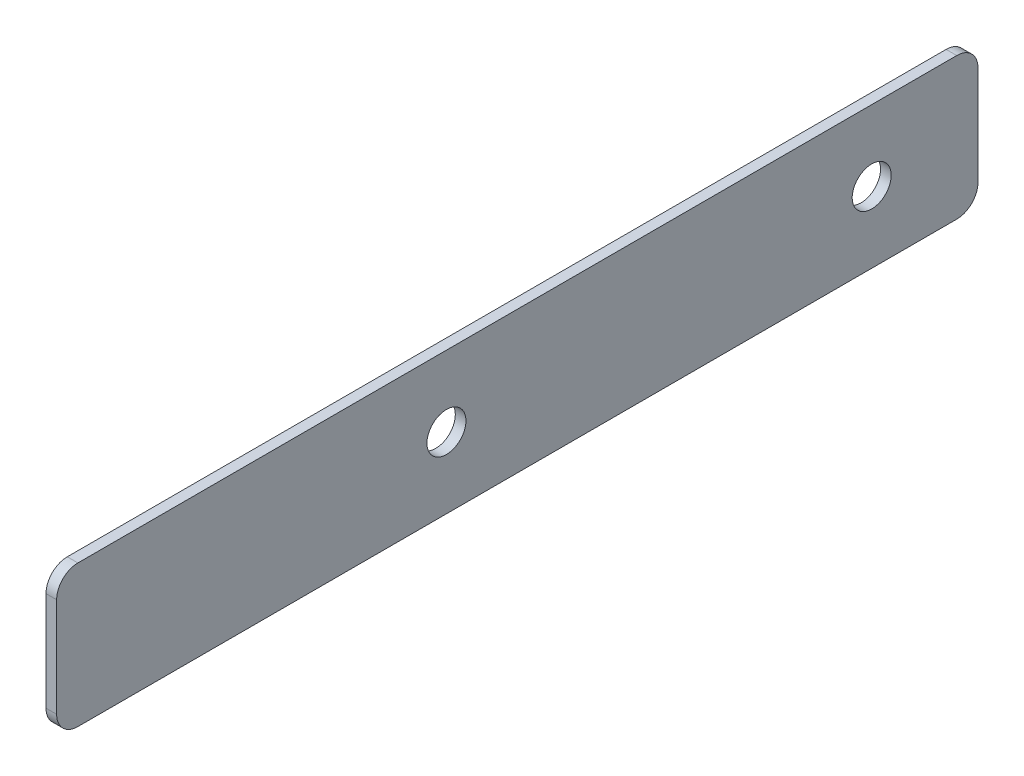
ISO-10303-21;
HEADER;
FILE_DESCRIPTION(('STEP AP214'),'2;1');
FILE_NAME('part.step','',(''),(''),'','','');
FILE_SCHEMA(('AUTOMOTIVE_DESIGN { 1 0 10303 214 1 1 1 1 }'));
ENDSEC;
DATA;
#1=APPLICATION_CONTEXT('core data for automotive mechanical design processes');
#2=APPLICATION_PROTOCOL_DEFINITION('international standard','automotive_design',2000,#1);
#3=PRODUCT_CONTEXT('',#1,'mechanical');
#4=PRODUCT('Part','Part','',(#3));
#5=PRODUCT_RELATED_PRODUCT_CATEGORY('part','',(#4));
#6=PRODUCT_DEFINITION_FORMATION('','',#4);
#7=PRODUCT_DEFINITION_CONTEXT('part definition',#1,'design');
#8=PRODUCT_DEFINITION('design','',#6,#7);
#9=PRODUCT_DEFINITION_SHAPE('','',#8);
#10=(LENGTH_UNIT() NAMED_UNIT(*) SI_UNIT(.MILLI.,.METRE.));
#11=(NAMED_UNIT(*) PLANE_ANGLE_UNIT() SI_UNIT($,.RADIAN.));
#12=(NAMED_UNIT(*) SI_UNIT($,.STERADIAN.) SOLID_ANGLE_UNIT());
#13=UNCERTAINTY_MEASURE_WITH_UNIT(LENGTH_MEASURE(1.E-05),#10,'distance_accuracy_value','');
#14=(GEOMETRIC_REPRESENTATION_CONTEXT(3) GLOBAL_UNCERTAINTY_ASSIGNED_CONTEXT((#13)) GLOBAL_UNIT_ASSIGNED_CONTEXT((#10,
#11,#12)) REPRESENTATION_CONTEXT('',''));
#15=CARTESIAN_POINT('',(0.,0.,0.));
#16=DIRECTION('',(0.,0.,1.));
#17=DIRECTION('',(1.,0.,0.));
#18=AXIS2_PLACEMENT_3D('',#15,#16,#17);
#19=CARTESIAN_POINT('',(-1.5,10.,-65.));
#20=DIRECTION('',(0.,0.,-1.));
#21=DIRECTION('',(-1.,0.,0.));
#22=AXIS2_PLACEMENT_3D('',#19,#20,#21);
#23=PLANE('',#22);
#24=DIRECTION('',(0.,1.,0.));
#25=VECTOR('',#24,1.);
#26=CARTESIAN_POINT('',(0.,10.,-65.));
#27=LINE('',#26,#25);
#28=CARTESIAN_POINT('',(0.,-7.,-65.));
#29=VERTEX_POINT('',#28);
#30=CARTESIAN_POINT('',(0.,7.,-65.));
#31=VERTEX_POINT('',#30);
#32=EDGE_CURVE('E181',#29,#31,#27,.T.);
#33=ORIENTED_EDGE('',*,*,#32,.F.);
#34=DIRECTION('',(1.,0.,0.));
#35=VECTOR('',#34,1.);
#36=CARTESIAN_POINT('',(-1.5,-7.,-65.));
#37=LINE('',#36,#35);
#38=CARTESIAN_POINT('',(-1.5,-7.,-65.));
#39=VERTEX_POINT('',#38);
#40=EDGE_CURVE('E156',#29,#39,#37,.F.);
#41=ORIENTED_EDGE('',*,*,#40,.T.);
#42=DIRECTION('',(0.,1.,0.));
#43=VECTOR('',#42,1.);
#44=CARTESIAN_POINT('',(-1.5,10.,-65.));
#45=LINE('',#44,#43);
#46=CARTESIAN_POINT('',(-1.5,7.,-65.));
#47=VERTEX_POINT('',#46);
#48=EDGE_CURVE('E137',#39,#47,#45,.T.);
#49=ORIENTED_EDGE('',*,*,#48,.T.);
#50=DIRECTION('',(1.,0.,0.));
#51=VECTOR('',#50,1.);
#52=CARTESIAN_POINT('',(-1.5,7.,-65.));
#53=LINE('',#52,#51);
#54=EDGE_CURVE('E153',#47,#31,#53,.T.);
#55=ORIENTED_EDGE('',*,*,#54,.T.);
#56=EDGE_LOOP('',(#33,#41,#49,#55));
#57=FACE_BOUND('',#56,.T.);
#58=ADVANCED_FACE('F50',(#57),#23,.T.);
#59=CARTESIAN_POINT('',(-1.5,-10.,65.));
#60=DIRECTION('',(0.,-1.,0.));
#61=DIRECTION('',(0.,0.,-1.));
#62=AXIS2_PLACEMENT_3D('',#59,#60,#61);
#63=PLANE('',#62);
#64=DIRECTION('',(0.,0.,-1.));
#65=VECTOR('',#64,1.);
#66=CARTESIAN_POINT('',(-1.5,-10.,65.));
#67=LINE('',#66,#65);
#68=CARTESIAN_POINT('',(-1.5,-10.,62.));
#69=VERTEX_POINT('',#68);
#70=CARTESIAN_POINT('',(-1.5,-10.,-62.));
#71=VERTEX_POINT('',#70);
#72=EDGE_CURVE('E142',#69,#71,#67,.T.);
#73=ORIENTED_EDGE('',*,*,#72,.T.);
#74=DIRECTION('',(1.,0.,0.));
#75=VECTOR('',#74,1.);
#76=CARTESIAN_POINT('',(-1.5,-10.,-62.));
#77=LINE('',#76,#75);
#78=CARTESIAN_POINT('',(0.,-10.,-62.));
#79=VERTEX_POINT('',#78);
#80=EDGE_CURVE('E136',#71,#79,#77,.T.);
#81=ORIENTED_EDGE('',*,*,#80,.T.);
#82=DIRECTION('',(0.,0.,-1.));
#83=VECTOR('',#82,1.);
#84=CARTESIAN_POINT('',(0.,-10.,65.));
#85=LINE('',#84,#83);
#86=CARTESIAN_POINT('',(0.,-10.,62.));
#87=VERTEX_POINT('',#86);
#88=EDGE_CURVE('E120',#87,#79,#85,.T.);
#89=ORIENTED_EDGE('',*,*,#88,.F.);
#90=DIRECTION('',(1.,0.,0.));
#91=VECTOR('',#90,1.);
#92=CARTESIAN_POINT('',(-1.5,-10.,62.));
#93=LINE('',#92,#91);
#94=EDGE_CURVE('E133',#87,#69,#93,.F.);
#95=ORIENTED_EDGE('',*,*,#94,.T.);
#96=EDGE_LOOP('',(#73,#81,#89,#95));
#97=FACE_BOUND('',#96,.T.);
#98=ADVANCED_FACE('F132',(#97),#63,.T.);
#99=CARTESIAN_POINT('',(-1.5,10.,65.));
#100=DIRECTION('',(0.,0.,1.));
#101=DIRECTION('',(1.,0.,0.));
#102=AXIS2_PLACEMENT_3D('',#99,#100,#101);
#103=PLANE('',#102);
#104=DIRECTION('',(0.,-1.,0.));
#105=VECTOR('',#104,1.);
#106=CARTESIAN_POINT('',(-1.5,10.,65.));
#107=LINE('',#106,#105);
#108=CARTESIAN_POINT('',(-1.5,7.,65.));
#109=VERTEX_POINT('',#108);
#110=CARTESIAN_POINT('',(-1.5,-7.,65.));
#111=VERTEX_POINT('',#110);
#112=EDGE_CURVE('E145',#109,#111,#107,.T.);
#113=ORIENTED_EDGE('',*,*,#112,.T.);
#114=DIRECTION('',(1.,0.,0.));
#115=VECTOR('',#114,1.);
#116=CARTESIAN_POINT('',(-1.5,-7.,65.));
#117=LINE('',#116,#115);
#118=CARTESIAN_POINT('',(0.,-7.,65.));
#119=VERTEX_POINT('',#118);
#120=EDGE_CURVE('E13',#111,#119,#117,.T.);
#121=ORIENTED_EDGE('',*,*,#120,.T.);
#122=DIRECTION('',(0.,-1.,0.));
#123=VECTOR('',#122,1.);
#124=CARTESIAN_POINT('',(0.,10.,65.));
#125=LINE('',#124,#123);
#126=CARTESIAN_POINT('',(0.,7.,65.));
#127=VERTEX_POINT('',#126);
#128=EDGE_CURVE('E122',#127,#119,#125,.T.);
#129=ORIENTED_EDGE('',*,*,#128,.F.);
#130=DIRECTION('',(1.,0.,0.));
#131=VECTOR('',#130,1.);
#132=CARTESIAN_POINT('',(-1.5,7.,65.));
#133=LINE('',#132,#131);
#134=EDGE_CURVE('E58',#127,#109,#133,.F.);
#135=ORIENTED_EDGE('',*,*,#134,.T.);
#136=EDGE_LOOP('',(#113,#121,#129,#135));
#137=FACE_BOUND('',#136,.T.);
#138=ADVANCED_FACE('F170',(#137),#103,.T.);
#139=CARTESIAN_POINT('',(-1.5,10.,65.));
#140=DIRECTION('',(0.,1.,0.));
#141=DIRECTION('',(0.,0.,1.));
#142=AXIS2_PLACEMENT_3D('',#139,#140,#141);
#143=PLANE('',#142);
#144=DIRECTION('',(0.,0.,1.));
#145=VECTOR('',#144,1.);
#146=CARTESIAN_POINT('',(0.,10.,65.));
#147=LINE('',#146,#145);
#148=CARTESIAN_POINT('',(0.,10.,-62.));
#149=VERTEX_POINT('',#148);
#150=CARTESIAN_POINT('',(0.,10.,62.));
#151=VERTEX_POINT('',#150);
#152=EDGE_CURVE('E179',#149,#151,#147,.T.);
#153=ORIENTED_EDGE('',*,*,#152,.F.);
#154=DIRECTION('',(1.,0.,0.));
#155=VECTOR('',#154,1.);
#156=CARTESIAN_POINT('',(-1.5,10.,-62.));
#157=LINE('',#156,#155);
#158=CARTESIAN_POINT('',(-1.5,10.,-62.));
#159=VERTEX_POINT('',#158);
#160=EDGE_CURVE('E72',#149,#159,#157,.F.);
#161=ORIENTED_EDGE('',*,*,#160,.T.);
#162=DIRECTION('',(0.,0.,1.));
#163=VECTOR('',#162,1.);
#164=CARTESIAN_POINT('',(-1.5,10.,65.));
#165=LINE('',#164,#163);
#166=CARTESIAN_POINT('',(-1.5,10.,62.));
#167=VERTEX_POINT('',#166);
#168=EDGE_CURVE('E174',#159,#167,#165,.T.);
#169=ORIENTED_EDGE('',*,*,#168,.T.);
#170=DIRECTION('',(1.,0.,0.));
#171=VECTOR('',#170,1.);
#172=CARTESIAN_POINT('',(-1.5,10.,62.));
#173=LINE('',#172,#171);
#174=EDGE_CURVE('E164',#167,#151,#173,.T.);
#175=ORIENTED_EDGE('',*,*,#174,.T.);
#176=EDGE_LOOP('',(#153,#161,#169,#175));
#177=FACE_BOUND('',#176,.T.);
#178=ADVANCED_FACE('F178',(#177),#143,.T.);
#179=CARTESIAN_POINT('',(-1.5,0.,0.));
#180=DIRECTION('',(1.,0.,0.));
#181=DIRECTION('',(0.,0.,-1.));
#182=AXIS2_PLACEMENT_3D('',#179,#180,#181);
#183=PLANE('',#182);
#184=CARTESIAN_POINT('',(-1.5,0.,9.99999999999999));
#185=DIRECTION('',(1.,0.,0.));
#186=DIRECTION('',(0.,0.,-1.));
#187=AXIS2_PLACEMENT_3D('',#184,#185,#186);
#188=CIRCLE('',#187,2.75);
#189=CARTESIAN_POINT('',(-1.5,0.,7.25));
#190=VERTEX_POINT('',#189);
#191=EDGE_CURVE('E194',#190,#190,#188,.T.);
#192=ORIENTED_EDGE('',*,*,#191,.T.);
#193=EDGE_LOOP('',(#192));
#194=FACE_BOUND('',#193,.T.);
#195=CARTESIAN_POINT('',(-1.5,0.,-50.));
#196=DIRECTION('',(1.,0.,0.));
#197=DIRECTION('',(0.,0.,-1.));
#198=AXIS2_PLACEMENT_3D('',#195,#196,#197);
#199=CIRCLE('',#198,2.75);
#200=CARTESIAN_POINT('',(-1.5,0.,-52.75));
#201=VERTEX_POINT('',#200);
#202=EDGE_CURVE('E183',#201,#201,#199,.T.);
#203=ORIENTED_EDGE('',*,*,#202,.T.);
#204=EDGE_LOOP('',(#203));
#205=FACE_BOUND('',#204,.T.);
#206=ORIENTED_EDGE('',*,*,#48,.F.);
#207=CARTESIAN_POINT('',(-1.5,-7.,-62.));
#208=DIRECTION('',(1.,0.,0.));
#209=DIRECTION('',(0.,0.,-1.));
#210=AXIS2_PLACEMENT_3D('',#207,#208,#209);
#211=CIRCLE('',#210,3.);
#212=EDGE_CURVE('E162',#39,#71,#211,.F.);
#213=ORIENTED_EDGE('',*,*,#212,.T.);
#214=ORIENTED_EDGE('',*,*,#72,.F.);
#215=CARTESIAN_POINT('',(-1.5,-7.,62.));
#216=DIRECTION('',(1.,0.,0.));
#217=DIRECTION('',(0.,0.,-1.));
#218=AXIS2_PLACEMENT_3D('',#215,#216,#217);
#219=CIRCLE('',#218,3.);
#220=EDGE_CURVE('E141',#69,#111,#219,.F.);
#221=ORIENTED_EDGE('',*,*,#220,.T.);
#222=ORIENTED_EDGE('',*,*,#112,.F.);
#223=CARTESIAN_POINT('',(-1.5,7.,62.));
#224=DIRECTION('',(1.,0.,0.));
#225=DIRECTION('',(0.,0.,-1.));
#226=AXIS2_PLACEMENT_3D('',#223,#224,#225);
#227=CIRCLE('',#226,3.);
#228=EDGE_CURVE('E65',#109,#167,#227,.F.);
#229=ORIENTED_EDGE('',*,*,#228,.T.);
#230=ORIENTED_EDGE('',*,*,#168,.F.);
#231=CARTESIAN_POINT('',(-1.5,7.,-62.));
#232=DIRECTION('',(1.,0.,0.));
#233=DIRECTION('',(0.,0.,-1.));
#234=AXIS2_PLACEMENT_3D('',#231,#232,#233);
#235=CIRCLE('',#234,3.);
#236=EDGE_CURVE('E160',#159,#47,#235,.F.);
#237=ORIENTED_EDGE('',*,*,#236,.T.);
#238=EDGE_LOOP('',(#206,#213,#214,#221,#222,#229,#230,#237));
#239=FACE_BOUND('',#238,.T.);
#240=ADVANCED_FACE('F173',(#194,#205,#239),#183,.F.);
#241=CARTESIAN_POINT('',(0.,0.,0.));
#242=DIRECTION('',(1.,0.,0.));
#243=DIRECTION('',(0.,0.,-1.));
#244=AXIS2_PLACEMENT_3D('',#241,#242,#243);
#245=PLANE('',#244);
#246=CARTESIAN_POINT('',(0.,0.,9.99999999999999));
#247=DIRECTION('',(1.,0.,0.));
#248=DIRECTION('',(0.,0.,-1.));
#249=AXIS2_PLACEMENT_3D('',#246,#247,#248);
#250=CIRCLE('',#249,2.75);
#251=CARTESIAN_POINT('',(0.,0.,7.25));
#252=VERTEX_POINT('',#251);
#253=EDGE_CURVE('E197',#252,#252,#250,.T.);
#254=ORIENTED_EDGE('',*,*,#253,.F.);
#255=EDGE_LOOP('',(#254));
#256=FACE_BOUND('',#255,.T.);
#257=CARTESIAN_POINT('',(0.,0.,-50.));
#258=DIRECTION('',(1.,0.,0.));
#259=DIRECTION('',(0.,0.,-1.));
#260=AXIS2_PLACEMENT_3D('',#257,#258,#259);
#261=CIRCLE('',#260,2.75);
#262=CARTESIAN_POINT('',(0.,0.,-52.75));
#263=VERTEX_POINT('',#262);
#264=EDGE_CURVE('E191',#263,#263,#261,.T.);
#265=ORIENTED_EDGE('',*,*,#264,.F.);
#266=EDGE_LOOP('',(#265));
#267=FACE_BOUND('',#266,.T.);
#268=ORIENTED_EDGE('',*,*,#88,.T.);
#269=CARTESIAN_POINT('',(0.,-7.,-62.));
#270=DIRECTION('',(1.,0.,0.));
#271=DIRECTION('',(0.,0.,-1.));
#272=AXIS2_PLACEMENT_3D('',#269,#270,#271);
#273=CIRCLE('',#272,3.);
#274=EDGE_CURVE('E151',#79,#29,#273,.T.);
#275=ORIENTED_EDGE('',*,*,#274,.T.);
#276=ORIENTED_EDGE('',*,*,#32,.T.);
#277=CARTESIAN_POINT('',(0.,7.,-62.));
#278=DIRECTION('',(1.,0.,0.));
#279=DIRECTION('',(0.,0.,-1.));
#280=AXIS2_PLACEMENT_3D('',#277,#278,#279);
#281=CIRCLE('',#280,3.);
#282=EDGE_CURVE('E126',#31,#149,#281,.T.);
#283=ORIENTED_EDGE('',*,*,#282,.T.);
#284=ORIENTED_EDGE('',*,*,#152,.T.);
#285=CARTESIAN_POINT('',(0.,7.,62.));
#286=DIRECTION('',(1.,0.,0.));
#287=DIRECTION('',(0.,0.,-1.));
#288=AXIS2_PLACEMENT_3D('',#285,#286,#287);
#289=CIRCLE('',#288,3.);
#290=EDGE_CURVE('E127',#151,#127,#289,.T.);
#291=ORIENTED_EDGE('',*,*,#290,.T.);
#292=ORIENTED_EDGE('',*,*,#128,.T.);
#293=CARTESIAN_POINT('',(0.,-7.,62.));
#294=DIRECTION('',(1.,0.,0.));
#295=DIRECTION('',(0.,0.,-1.));
#296=AXIS2_PLACEMENT_3D('',#293,#294,#295);
#297=CIRCLE('',#296,3.);
#298=EDGE_CURVE('E117',#119,#87,#297,.T.);
#299=ORIENTED_EDGE('',*,*,#298,.T.);
#300=EDGE_LOOP('',(#268,#275,#276,#283,#284,#291,#292,#299));
#301=FACE_BOUND('',#300,.T.);
#302=ADVANCED_FACE('F119',(#256,#267,#301),#245,.T.);
#303=CARTESIAN_POINT('',(0.,0.,-50.));
#304=DIRECTION('',(1.,0.,0.));
#305=DIRECTION('',(0.,0.,-1.));
#306=AXIS2_PLACEMENT_3D('',#303,#304,#305);
#307=CYLINDRICAL_SURFACE('',#306,2.75);
#308=ORIENTED_EDGE('',*,*,#264,.T.);
#309=EDGE_LOOP('',(#308));
#310=FACE_BOUND('',#309,.T.);
#311=ORIENTED_EDGE('',*,*,#202,.F.);
#312=EDGE_LOOP('',(#311));
#313=FACE_BOUND('',#312,.T.);
#314=ADVANCED_FACE('F206',(#310,#313),#307,.F.);
#315=CARTESIAN_POINT('',(0.,0.,9.99999999999999));
#316=DIRECTION('',(1.,0.,0.));
#317=DIRECTION('',(0.,0.,-1.));
#318=AXIS2_PLACEMENT_3D('',#315,#316,#317);
#319=CYLINDRICAL_SURFACE('',#318,2.75);
#320=ORIENTED_EDGE('',*,*,#253,.T.);
#321=EDGE_LOOP('',(#320));
#322=FACE_BOUND('',#321,.T.);
#323=ORIENTED_EDGE('',*,*,#191,.F.);
#324=EDGE_LOOP('',(#323));
#325=FACE_BOUND('',#324,.T.);
#326=ADVANCED_FACE('F201',(#322,#325),#319,.F.);
#327=CARTESIAN_POINT('',(-1.5,-7.,-62.));
#328=DIRECTION('',(1.,0.,0.));
#329=DIRECTION('',(0.,0.,-1.));
#330=AXIS2_PLACEMENT_3D('',#327,#328,#329);
#331=CYLINDRICAL_SURFACE('',#330,3.);
#332=ORIENTED_EDGE('',*,*,#212,.F.);
#333=ORIENTED_EDGE('',*,*,#40,.F.);
#334=ORIENTED_EDGE('',*,*,#274,.F.);
#335=ORIENTED_EDGE('',*,*,#80,.F.);
#336=EDGE_LOOP('',(#332,#333,#334,#335));
#337=FACE_BOUND('',#336,.T.);
#338=ADVANCED_FACE('F232',(#337),#331,.T.);
#339=CARTESIAN_POINT('',(-1.5,7.,-62.));
#340=DIRECTION('',(1.,0.,0.));
#341=DIRECTION('',(0.,0.,-1.));
#342=AXIS2_PLACEMENT_3D('',#339,#340,#341);
#343=CYLINDRICAL_SURFACE('',#342,3.);
#344=ORIENTED_EDGE('',*,*,#236,.F.);
#345=ORIENTED_EDGE('',*,*,#160,.F.);
#346=ORIENTED_EDGE('',*,*,#282,.F.);
#347=ORIENTED_EDGE('',*,*,#54,.F.);
#348=EDGE_LOOP('',(#344,#345,#346,#347));
#349=FACE_BOUND('',#348,.T.);
#350=ADVANCED_FACE('F235',(#349),#343,.T.);
#351=CARTESIAN_POINT('',(-1.5,-7.,62.));
#352=DIRECTION('',(1.,0.,0.));
#353=DIRECTION('',(0.,0.,-1.));
#354=AXIS2_PLACEMENT_3D('',#351,#352,#353);
#355=CYLINDRICAL_SURFACE('',#354,3.);
#356=ORIENTED_EDGE('',*,*,#220,.F.);
#357=ORIENTED_EDGE('',*,*,#94,.F.);
#358=ORIENTED_EDGE('',*,*,#298,.F.);
#359=ORIENTED_EDGE('',*,*,#120,.F.);
#360=EDGE_LOOP('',(#356,#357,#358,#359));
#361=FACE_BOUND('',#360,.T.);
#362=ADVANCED_FACE('F140',(#361),#355,.T.);
#363=CARTESIAN_POINT('',(-1.5,7.,62.));
#364=DIRECTION('',(1.,0.,0.));
#365=DIRECTION('',(0.,0.,-1.));
#366=AXIS2_PLACEMENT_3D('',#363,#364,#365);
#367=CYLINDRICAL_SURFACE('',#366,3.);
#368=ORIENTED_EDGE('',*,*,#228,.F.);
#369=ORIENTED_EDGE('',*,*,#134,.F.);
#370=ORIENTED_EDGE('',*,*,#290,.F.);
#371=ORIENTED_EDGE('',*,*,#174,.F.);
#372=EDGE_LOOP('',(#368,#369,#370,#371));
#373=FACE_BOUND('',#372,.T.);
#374=ADVANCED_FACE('F52',(#373),#367,.T.);
#375=CLOSED_SHELL('',(#58,#98,#138,#178,#240,#302,#314,#326,#338,#350,#362,#374));
#376=MANIFOLD_SOLID_BREP('B2',#375);
#377=ADVANCED_BREP_SHAPE_REPRESENTATION('',(#18,#376),#14);
#378=SHAPE_DEFINITION_REPRESENTATION(#9,#377);
ENDSEC;
END-ISO-10303-21;
